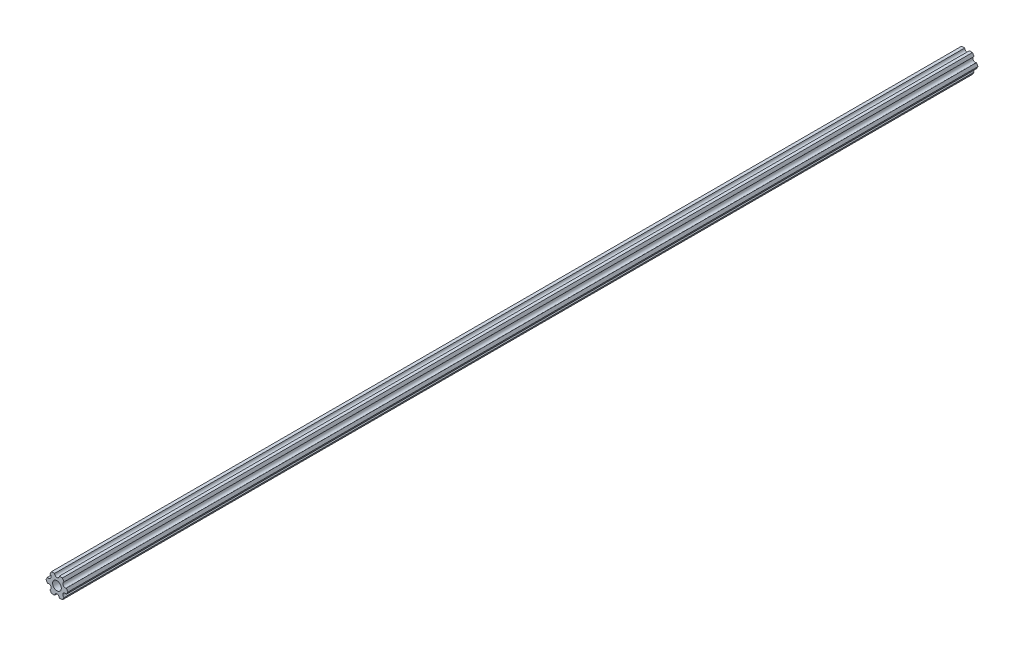
ISO-10303-21;
HEADER;
FILE_DESCRIPTION(('STEP AP214'),'2;1');
FILE_NAME('part.step','',(''),(''),'','','');
FILE_SCHEMA(('AUTOMOTIVE_DESIGN { 1 0 10303 214 1 1 1 1 }'));
ENDSEC;
DATA;
#1=APPLICATION_CONTEXT('core data for automotive mechanical design processes');
#2=APPLICATION_PROTOCOL_DEFINITION('international standard','automotive_design',2000,#1);
#3=PRODUCT_CONTEXT('',#1,'mechanical');
#4=PRODUCT('Part','Part','',(#3));
#5=PRODUCT_RELATED_PRODUCT_CATEGORY('part','',(#4));
#6=PRODUCT_DEFINITION_FORMATION('','',#4);
#7=PRODUCT_DEFINITION_CONTEXT('part definition',#1,'design');
#8=PRODUCT_DEFINITION('design','',#6,#7);
#9=PRODUCT_DEFINITION_SHAPE('','',#8);
#10=(LENGTH_UNIT() NAMED_UNIT(*) SI_UNIT(.MILLI.,.METRE.));
#11=(NAMED_UNIT(*) PLANE_ANGLE_UNIT() SI_UNIT($,.RADIAN.));
#12=(NAMED_UNIT(*) SI_UNIT($,.STERADIAN.) SOLID_ANGLE_UNIT());
#13=UNCERTAINTY_MEASURE_WITH_UNIT(LENGTH_MEASURE(1.E-05),#10,'distance_accuracy_value','');
#14=(GEOMETRIC_REPRESENTATION_CONTEXT(3) GLOBAL_UNCERTAINTY_ASSIGNED_CONTEXT((#13)) GLOBAL_UNIT_ASSIGNED_CONTEXT((#10,
#11,#12)) REPRESENTATION_CONTEXT('',''));
#15=CARTESIAN_POINT('',(0.,0.,0.));
#16=DIRECTION('',(0.,0.,1.));
#17=DIRECTION('',(1.,0.,0.));
#18=AXIS2_PLACEMENT_3D('',#15,#16,#17);
#19=CARTESIAN_POINT('',(6.29301142309098,-1.80018429024546,85.725));
#20=DIRECTION('',(-0.866025434075723,0.499999947533953,0.));
#21=DIRECTION('',(0.,0.,1.));
#22=AXIS2_PLACEMENT_3D('',#19,#20,#21);
#23=PLANE('',#22);
#24=DIRECTION('',(0.,0.,1.));
#25=VECTOR('',#24,1.);
#26=CARTESIAN_POINT('',(7.33234841870827,4.44212519169686E-07,85.725));
#27=LINE('',#26,#25);
#28=CARTESIAN_POINT('',(7.33234841870826,4.44212518961143E-07,-523.875));
#29=VERTEX_POINT('',#28);
#30=CARTESIAN_POINT('',(7.33234841870826,4.44212519315656E-07,85.725));
#31=VERTEX_POINT('',#30);
#32=EDGE_CURVE('E11',#29,#31,#27,.T.);
#33=ORIENTED_EDGE('',*,*,#32,.T.);
#34=DIRECTION('',(0.499999947533953,0.866025434075723,0.));
#35=VECTOR('',#34,1.);
#36=CARTESIAN_POINT('',(6.29301142309098,-1.80018429024546,85.725));
#37=LINE('',#36,#35);
#38=CARTESIAN_POINT('',(6.29301142309098,-1.80018429024546,85.725));
#39=VERTEX_POINT('',#38);
#40=EDGE_CURVE('E301',#39,#31,#37,.T.);
#41=ORIENTED_EDGE('',*,*,#40,.F.);
#42=DIRECTION('',(0.,0.,-1.));
#43=VECTOR('',#42,1.);
#44=CARTESIAN_POINT('',(6.29301142309098,-1.80018429024546,85.725));
#45=LINE('',#44,#43);
#46=CARTESIAN_POINT('',(6.29301142309098,-1.80018429024546,-523.875));
#47=VERTEX_POINT('',#46);
#48=EDGE_CURVE('E300',#39,#47,#45,.T.);
#49=ORIENTED_EDGE('',*,*,#48,.T.);
#50=DIRECTION('',(-0.499999947533953,-0.866025434075723,0.));
#51=VECTOR('',#50,1.);
#52=CARTESIAN_POINT('',(6.29301142309098,-1.80018429024546,-523.875));
#53=LINE('',#52,#51);
#54=EDGE_CURVE('E219',#29,#47,#53,.T.);
#55=ORIENTED_EDGE('',*,*,#54,.F.);
#56=EDGE_LOOP('',(#33,#41,#49,#55));
#57=FACE_BOUND('',#56,.T.);
#58=ADVANCED_FACE('F51',(#57),#23,.F.);
#59=CARTESIAN_POINT('',(7.33234841870827,4.44212519169686E-07,85.725));
#60=DIRECTION('',(-0.866025373493145,-0.500000052466057,0.));
#61=DIRECTION('',(-0.500000052466057,0.866025373493145,0.));
#62=AXIS2_PLACEMENT_3D('',#59,#60,#61);
#63=PLANE('',#62);
#64=DIRECTION('',(0.,0.,1.));
#65=VECTOR('',#64,1.);
#66=CARTESIAN_POINT('',(6.29301120497139,1.80018505273894,85.725));
#67=LINE('',#66,#65);
#68=CARTESIAN_POINT('',(6.29301120497139,1.80018505273894,-523.875));
#69=VERTEX_POINT('',#68);
#70=CARTESIAN_POINT('',(6.29301120497139,1.80018505273894,85.725));
#71=VERTEX_POINT('',#70);
#72=EDGE_CURVE('E59',#69,#71,#67,.T.);
#73=ORIENTED_EDGE('',*,*,#72,.T.);
#74=DIRECTION('',(-0.500000052466057,0.866025373493145,0.));
#75=VECTOR('',#74,1.);
#76=CARTESIAN_POINT('',(7.33234841870827,4.44212519198906E-07,85.725));
#77=LINE('',#76,#75);
#78=EDGE_CURVE('E305',#31,#71,#77,.T.);
#79=ORIENTED_EDGE('',*,*,#78,.F.);
#80=ORIENTED_EDGE('',*,*,#32,.F.);
#81=DIRECTION('',(0.500000052466055,-0.866025373493145,0.));
#82=VECTOR('',#81,1.);
#83=CARTESIAN_POINT('',(7.33234841870826,4.44212518961143E-07,-523.875));
#84=LINE('',#83,#82);
#85=EDGE_CURVE('E213',#69,#29,#84,.T.);
#86=ORIENTED_EDGE('',*,*,#85,.F.);
#87=EDGE_LOOP('',(#73,#79,#80,#86));
#88=FACE_BOUND('',#87,.T.);
#89=ADVANCED_FACE('F214',(#88),#63,.F.);
#90=CARTESIAN_POINT('',(4.70551103839172,4.54981561357972,85.725));
#91=DIRECTION('',(-0.866025373493151,-0.500000052466046,0.));
#92=DIRECTION('',(-0.500000052466046,0.866025373493151,0.));
#93=AXIS2_PLACEMENT_3D('',#90,#91,#92);
#94=PLANE('',#93);
#95=DIRECTION('',(0.,0.,1.));
#96=VECTOR('',#95,1.);
#97=CARTESIAN_POINT('',(3.66617382465481,6.35000022210627,85.725));
#98=LINE('',#97,#96);
#99=CARTESIAN_POINT('',(3.66617382465481,6.35000022210627,-523.875));
#100=VERTEX_POINT('',#99);
#101=CARTESIAN_POINT('',(3.66617382465481,6.35000022210627,85.725));
#102=VERTEX_POINT('',#101);
#103=EDGE_CURVE('E211',#100,#102,#98,.T.);
#104=ORIENTED_EDGE('',*,*,#103,.T.);
#105=DIRECTION('',(-0.500000052466046,0.866025373493151,0.));
#106=VECTOR('',#105,1.);
#107=CARTESIAN_POINT('',(4.70551103839172,4.54981561357972,85.725));
#108=LINE('',#107,#106);
#109=CARTESIAN_POINT('',(4.70551103839172,4.54981561357972,85.725));
#110=VERTEX_POINT('',#109);
#111=EDGE_CURVE('E336',#110,#102,#108,.T.);
#112=ORIENTED_EDGE('',*,*,#111,.F.);
#113=DIRECTION('',(0.,0.,1.));
#114=VECTOR('',#113,1.);
#115=CARTESIAN_POINT('',(4.70551103839172,4.54981561357972,85.725));
#116=LINE('',#115,#114);
#117=CARTESIAN_POINT('',(4.70551103839172,4.54981561357972,-523.875));
#118=VERTEX_POINT('',#117);
#119=EDGE_CURVE('E299',#118,#110,#116,.T.);
#120=ORIENTED_EDGE('',*,*,#119,.F.);
#121=DIRECTION('',(0.500000052466045,-0.866025373493151,0.));
#122=VECTOR('',#121,1.);
#123=CARTESIAN_POINT('',(4.70551103839172,4.54981561357972,-523.875));
#124=LINE('',#123,#122);
#125=EDGE_CURVE('E225',#100,#118,#124,.T.);
#126=ORIENTED_EDGE('',*,*,#125,.F.);
#127=EDGE_LOOP('',(#104,#112,#120,#126));
#128=FACE_BOUND('',#127,.T.);
#129=ADVANCED_FACE('F412',(#128),#94,.F.);
#130=CARTESIAN_POINT('',(3.66617382465481,6.35000022210627,85.725));
#131=DIRECTION('',(6.05825850611185E-08,-1.,0.));
#132=DIRECTION('',(0.,0.,-1.));
#133=AXIS2_PLACEMENT_3D('',#130,#131,#132);
#134=PLANE('',#133);
#135=DIRECTION('',(0.,0.,1.));
#136=VECTOR('',#135,1.);
#137=CARTESIAN_POINT('',(1.58749961530074,6.35000009617482,85.725));
#138=LINE('',#137,#136);
#139=CARTESIAN_POINT('',(1.58749961530073,6.35000015914054,-523.875));
#140=VERTEX_POINT('',#139);
#141=CARTESIAN_POINT('',(1.58749961530073,6.35000015914054,85.725));
#142=VERTEX_POINT('',#141);
#143=EDGE_CURVE('E333',#140,#142,#138,.T.);
#144=ORIENTED_EDGE('',*,*,#143,.T.);
#145=DIRECTION('',(-1.,0.,0.));
#146=VECTOR('',#145,1.);
#147=CARTESIAN_POINT('',(5.49926112168156,6.35000022210627,85.725));
#148=LINE('',#147,#146);
#149=EDGE_CURVE('E340',#102,#142,#148,.T.);
#150=ORIENTED_EDGE('',*,*,#149,.F.);
#151=ORIENTED_EDGE('',*,*,#103,.F.);
#152=DIRECTION('',(1.,3.02912931564594E-08,0.));
#153=VECTOR('',#152,1.);
#154=CARTESIAN_POINT('',(3.66617382465481,6.35000022210627,-523.875));
#155=LINE('',#154,#153);
#156=EDGE_CURVE('E287',#140,#100,#155,.T.);
#157=ORIENTED_EDGE('',*,*,#156,.F.);
#158=EDGE_LOOP('',(#144,#150,#151,#157));
#159=FACE_BOUND('',#158,.T.);
#160=ADVANCED_FACE('F415',(#159),#134,.F.);
#161=CARTESIAN_POINT('',(-3.84699260060323E-07,6.35,85.725));
#162=DIRECTION('',(0.,0.,-1.));
#163=DIRECTION('',(-1.,0.,0.));
#164=AXIS2_PLACEMENT_3D('',#161,#162,#163);
#165=CYLINDRICAL_SURFACE('',#164,1.5875);
#166=DIRECTION('',(0.,0.,1.));
#167=VECTOR('',#166,1.);
#168=CARTESIAN_POINT('',(-1.58750038469926,6.34999990382518,85.725));
#169=LINE('',#168,#167);
#170=CARTESIAN_POINT('',(-1.58750038469926,6.34999990382519,-523.875));
#171=VERTEX_POINT('',#170);
#172=CARTESIAN_POINT('',(-1.58750038469926,6.34999990382519,85.725));
#173=VERTEX_POINT('',#172);
#174=EDGE_CURVE('E330',#171,#173,#169,.T.);
#175=ORIENTED_EDGE('',*,*,#174,.T.);
#176=CARTESIAN_POINT('',(-3.84699260060323E-07,6.35,85.725));
#177=DIRECTION('',(0.,0.,-1.));
#178=DIRECTION('',(-1.,0.,0.));
#179=AXIS2_PLACEMENT_3D('',#176,#177,#178);
#180=CIRCLE('',#179,1.5875);
#181=EDGE_CURVE('E344',#142,#173,#180,.T.);
#182=ORIENTED_EDGE('',*,*,#181,.F.);
#183=ORIENTED_EDGE('',*,*,#143,.F.);
#184=CARTESIAN_POINT('',(-3.84699260060323E-07,6.35,-523.875));
#185=DIRECTION('',(0.,0.,1.));
#186=DIRECTION('',(-1.,0.,0.));
#187=AXIS2_PLACEMENT_3D('',#184,#185,#186);
#188=CIRCLE('',#187,1.5875);
#189=EDGE_CURVE('E283',#171,#140,#188,.T.);
#190=ORIENTED_EDGE('',*,*,#189,.F.);
#191=EDGE_LOOP('',(#175,#182,#183,#190));
#192=FACE_BOUND('',#191,.T.);
#193=ADVANCED_FACE('F464',(#192),#165,.F.);
#194=CARTESIAN_POINT('',(-1.58750038469926,6.34999990382518,85.725));
#195=DIRECTION('',(6.05825963273174E-08,-1.,0.));
#196=DIRECTION('',(0.,0.,-1.));
#197=AXIS2_PLACEMENT_3D('',#194,#195,#196);
#198=PLANE('',#197);
#199=DIRECTION('',(0.,0.,1.));
#200=VECTOR('',#199,1.);
#201=CARTESIAN_POINT('',(-3.66617459405349,6.3499997778937,85.725));
#202=LINE('',#201,#200);
#203=CARTESIAN_POINT('',(-3.66617454558244,6.34999986184803,-523.875));
#204=VERTEX_POINT('',#203);
#205=CARTESIAN_POINT('',(-3.66617454558244,6.34999986184803,85.725));
#206=VERTEX_POINT('',#205);
#207=EDGE_CURVE('E323',#204,#206,#202,.T.);
#208=ORIENTED_EDGE('',*,*,#207,.T.);
#209=DIRECTION('',(-1.,0.,0.));
#210=VECTOR('',#209,1.);
#211=CARTESIAN_POINT('',(5.49926112168156,6.34999990382519,85.725));
#212=LINE('',#211,#210);
#213=EDGE_CURVE('E348',#173,#206,#212,.T.);
#214=ORIENTED_EDGE('',*,*,#213,.F.);
#215=ORIENTED_EDGE('',*,*,#174,.F.);
#216=DIRECTION('',(1.,2.0194198968488E-08,0.));
#217=VECTOR('',#216,1.);
#218=CARTESIAN_POINT('',(-1.58750038469926,6.34999990382519,-523.875));
#219=LINE('',#218,#217);
#220=EDGE_CURVE('E279',#204,#171,#219,.T.);
#221=ORIENTED_EDGE('',*,*,#220,.F.);
#222=EDGE_LOOP('',(#208,#214,#215,#221));
#223=FACE_BOUND('',#222,.T.);
#224=ADVANCED_FACE('F461',(#223),#198,.F.);
#225=CARTESIAN_POINT('',(-3.66617459405349,6.3499997778937,85.725));
#226=DIRECTION('',(0.866025434075729,-0.499999947533942,0.));
#227=DIRECTION('',(0.,0.,-1.));
#228=AXIS2_PLACEMENT_3D('',#225,#226,#227);
#229=PLANE('',#228);
#230=DIRECTION('',(0.,0.,1.));
#231=VECTOR('',#230,1.);
#232=CARTESIAN_POINT('',(-4.70551158967065,4.54981504343587,85.725));
#233=LINE('',#232,#231);
#234=CARTESIAN_POINT('',(-4.70551158967065,4.54981504343587,-523.875));
#235=VERTEX_POINT('',#234);
#236=CARTESIAN_POINT('',(-4.70551158967065,4.54981504343587,85.725));
#237=VERTEX_POINT('',#236);
#238=EDGE_CURVE('E320',#235,#237,#233,.T.);
#239=ORIENTED_EDGE('',*,*,#238,.T.);
#240=DIRECTION('',(-0.499999947533943,-0.866025434075729,0.));
#241=VECTOR('',#240,1.);
#242=CARTESIAN_POINT('',(-3.66617459405349,6.3499997778937,85.725));
#243=LINE('',#242,#241);
#244=EDGE_CURVE('E352',#206,#237,#243,.T.);
#245=ORIENTED_EDGE('',*,*,#244,.F.);
#246=ORIENTED_EDGE('',*,*,#207,.F.);
#247=DIRECTION('',(0.499999947533939,0.866025434075731,0.));
#248=VECTOR('',#247,1.);
#249=CARTESIAN_POINT('',(-3.66617454558244,6.34999986184803,-523.875));
#250=LINE('',#249,#248);
#251=EDGE_CURVE('E275',#235,#204,#250,.T.);
#252=ORIENTED_EDGE('',*,*,#251,.F.);
#253=EDGE_LOOP('',(#239,#245,#246,#252));
#254=FACE_BOUND('',#253,.T.);
#255=ADVANCED_FACE('F457',(#254),#229,.F.);
#256=CARTESIAN_POINT('',(-5.49926150638082,3.17499966684067,85.725));
#257=DIRECTION('',(0.,0.,-1.));
#258=DIRECTION('',(-1.,0.,0.));
#259=AXIS2_PLACEMENT_3D('',#256,#257,#258);
#260=CYLINDRICAL_SURFACE('',#259,1.5875);
#261=DIRECTION('',(0.,0.,1.));
#262=VECTOR('',#261,1.);
#263=CARTESIAN_POINT('',(-6.29301142309098,1.80018429024547,85.725));
#264=LINE('',#263,#262);
#265=CARTESIAN_POINT('',(-6.29301142309098,1.80018429024546,-523.875));
#266=VERTEX_POINT('',#265);
#267=CARTESIAN_POINT('',(-6.29301142309098,1.80018429024547,85.725));
#268=VERTEX_POINT('',#267);
#269=EDGE_CURVE('E324',#266,#268,#264,.T.);
#270=ORIENTED_EDGE('',*,*,#269,.T.);
#271=CARTESIAN_POINT('',(-5.49926150638082,3.17499966684067,85.725));
#272=DIRECTION('',(0.,0.,-1.));
#273=DIRECTION('',(-1.,0.,0.));
#274=AXIS2_PLACEMENT_3D('',#271,#272,#273);
#275=CIRCLE('',#274,1.5875);
#276=EDGE_CURVE('E362',#237,#268,#275,.T.);
#277=ORIENTED_EDGE('',*,*,#276,.F.);
#278=ORIENTED_EDGE('',*,*,#238,.F.);
#279=CARTESIAN_POINT('',(-5.49926150638082,3.17499966684067,-523.875));
#280=DIRECTION('',(0.,0.,1.));
#281=DIRECTION('',(-1.,0.,0.));
#282=AXIS2_PLACEMENT_3D('',#279,#280,#281);
#283=CIRCLE('',#282,1.5875);
#284=EDGE_CURVE('E271',#266,#235,#283,.T.);
#285=ORIENTED_EDGE('',*,*,#284,.F.);
#286=EDGE_LOOP('',(#270,#277,#278,#285));
#287=FACE_BOUND('',#286,.T.);
#288=ADVANCED_FACE('F453',(#287),#260,.F.);
#289=CARTESIAN_POINT('',(-6.29301142309098,1.80018429024547,85.725));
#290=DIRECTION('',(0.866025434075724,-0.499999947533952,0.));
#291=DIRECTION('',(0.,0.,-1.));
#292=AXIS2_PLACEMENT_3D('',#289,#290,#291);
#293=PLANE('',#292);
#294=DIRECTION('',(0.,0.,1.));
#295=VECTOR('',#294,1.);
#296=CARTESIAN_POINT('',(-7.33234841870827,-4.44212523790841E-07,85.725));
#297=LINE('',#296,#295);
#298=CARTESIAN_POINT('',(-7.33234841870826,-4.44212524036367E-07,-523.875));
#299=VERTEX_POINT('',#298);
#300=CARTESIAN_POINT('',(-7.33234841870826,-4.44212524036367E-07,85.725));
#301=VERTEX_POINT('',#300);
#302=EDGE_CURVE('E317',#299,#301,#297,.T.);
#303=ORIENTED_EDGE('',*,*,#302,.T.);
#304=DIRECTION('',(-0.499999947533952,-0.866025434075724,0.));
#305=VECTOR('',#304,1.);
#306=CARTESIAN_POINT('',(-6.29301142309098,1.80018429024547,85.725));
#307=LINE('',#306,#305);
#308=EDGE_CURVE('E358',#268,#301,#307,.T.);
#309=ORIENTED_EDGE('',*,*,#308,.F.);
#310=ORIENTED_EDGE('',*,*,#269,.F.);
#311=DIRECTION('',(0.499999947533951,0.866025434075724,0.));
#312=VECTOR('',#311,1.);
#313=CARTESIAN_POINT('',(-6.29301142309098,1.80018429024547,-523.875));
#314=LINE('',#313,#312);
#315=EDGE_CURVE('E267',#299,#266,#314,.T.);
#316=ORIENTED_EDGE('',*,*,#315,.F.);
#317=EDGE_LOOP('',(#303,#309,#310,#316));
#318=FACE_BOUND('',#317,.T.);
#319=ADVANCED_FACE('F449',(#318),#293,.F.);
#320=CARTESIAN_POINT('',(-7.33234841870827,-4.44212523790841E-07,85.725));
#321=DIRECTION('',(0.866025373493151,0.500000052466045,0.));
#322=DIRECTION('',(0.,0.,-1.));
#323=AXIS2_PLACEMENT_3D('',#320,#321,#322);
#324=PLANE('',#323);
#325=DIRECTION('',(0.,0.,1.));
#326=VECTOR('',#325,1.);
#327=CARTESIAN_POINT('',(-6.29301120497141,-1.80018505273897,85.725));
#328=LINE('',#327,#326);
#329=CARTESIAN_POINT('',(-6.29301120497141,-1.80018505273897,-523.875));
#330=VERTEX_POINT('',#329);
#331=CARTESIAN_POINT('',(-6.29301120497141,-1.80018505273897,85.725));
#332=VERTEX_POINT('',#331);
#333=EDGE_CURVE('E310',#330,#332,#328,.T.);
#334=ORIENTED_EDGE('',*,*,#333,.T.);
#335=DIRECTION('',(0.500000052466045,-0.866025373493151,0.));
#336=VECTOR('',#335,1.);
#337=CARTESIAN_POINT('',(-7.33234841870827,-4.44212523969395E-07,85.725));
#338=LINE('',#337,#336);
#339=EDGE_CURVE('E353',#301,#332,#338,.T.);
#340=ORIENTED_EDGE('',*,*,#339,.F.);
#341=ORIENTED_EDGE('',*,*,#302,.F.);
#342=DIRECTION('',(-0.500000052466045,0.866025373493152,0.));
#343=VECTOR('',#342,1.);
#344=CARTESIAN_POINT('',(-7.33234841870826,-4.44212524036367E-07,-523.875));
#345=LINE('',#344,#343);
#346=EDGE_CURVE('E263',#330,#299,#345,.T.);
#347=ORIENTED_EDGE('',*,*,#346,.F.);
#348=EDGE_LOOP('',(#334,#340,#341,#347));
#349=FACE_BOUND('',#348,.T.);
#350=ADVANCED_FACE('F445',(#349),#324,.F.);
#351=CARTESIAN_POINT('',(-5.49926112168156,-3.17500033315934,85.725));
#352=DIRECTION('',(0.,0.,-1.));
#353=DIRECTION('',(-1.,0.,0.));
#354=AXIS2_PLACEMENT_3D('',#351,#352,#353);
#355=CYLINDRICAL_SURFACE('',#354,1.5875);
#356=DIRECTION('',(0.,0.,1.));
#357=VECTOR('',#356,1.);
#358=CARTESIAN_POINT('',(-4.70551103839172,-4.54981561357972,85.725));
#359=LINE('',#358,#357);
#360=CARTESIAN_POINT('',(-4.70551103839172,-4.54981561357972,-523.875));
#361=VERTEX_POINT('',#360);
#362=CARTESIAN_POINT('',(-4.70551103839172,-4.54981561357972,85.725));
#363=VERTEX_POINT('',#362);
#364=EDGE_CURVE('E307',#361,#363,#359,.T.);
#365=ORIENTED_EDGE('',*,*,#364,.T.);
#366=CARTESIAN_POINT('',(-5.49926112168156,-3.17500033315934,85.725));
#367=DIRECTION('',(0.,0.,-1.));
#368=DIRECTION('',(-1.,0.,0.));
#369=AXIS2_PLACEMENT_3D('',#366,#367,#368);
#370=CIRCLE('',#369,1.5875);
#371=EDGE_CURVE('E357',#332,#363,#370,.T.);
#372=ORIENTED_EDGE('',*,*,#371,.F.);
#373=ORIENTED_EDGE('',*,*,#333,.F.);
#374=CARTESIAN_POINT('',(-5.49926112168156,-3.17500033315934,-523.875));
#375=DIRECTION('',(0.,0.,1.));
#376=DIRECTION('',(-1.,0.,0.));
#377=AXIS2_PLACEMENT_3D('',#374,#375,#376);
#378=CIRCLE('',#377,1.5875);
#379=EDGE_CURVE('E259',#361,#330,#378,.T.);
#380=ORIENTED_EDGE('',*,*,#379,.F.);
#381=EDGE_LOOP('',(#365,#372,#373,#380));
#382=FACE_BOUND('',#381,.T.);
#383=ADVANCED_FACE('F441',(#382),#355,.F.);
#384=CARTESIAN_POINT('',(-4.70551103839172,-4.54981561357972,85.725));
#385=DIRECTION('',(0.866025373493152,0.500000052466045,0.));
#386=DIRECTION('',(0.,0.,-1.));
#387=AXIS2_PLACEMENT_3D('',#384,#385,#386);
#388=PLANE('',#387);
#389=DIRECTION('',(0.,0.,1.));
#390=VECTOR('',#389,1.);
#391=CARTESIAN_POINT('',(-3.66617382465481,-6.35000022210628,85.725));
#392=LINE('',#391,#390);
#393=CARTESIAN_POINT('',(-3.66617382465481,-6.35000022210628,-523.875));
#394=VERTEX_POINT('',#393);
#395=CARTESIAN_POINT('',(-3.66617382465481,-6.35000022210628,85.725));
#396=VERTEX_POINT('',#395);
#397=EDGE_CURVE('E311',#394,#396,#392,.T.);
#398=ORIENTED_EDGE('',*,*,#397,.T.);
#399=DIRECTION('',(0.500000052466045,-0.866025373493151,0.));
#400=VECTOR('',#399,1.);
#401=CARTESIAN_POINT('',(-4.70551103839172,-4.54981561357972,85.725));
#402=LINE('',#401,#400);
#403=EDGE_CURVE('E372',#363,#396,#402,.T.);
#404=ORIENTED_EDGE('',*,*,#403,.F.);
#405=ORIENTED_EDGE('',*,*,#364,.F.);
#406=DIRECTION('',(-0.500000052466043,0.866025373493152,0.));
#407=VECTOR('',#406,1.);
#408=CARTESIAN_POINT('',(-4.70551103839172,-4.54981561357972,-523.875));
#409=LINE('',#408,#407);
#410=EDGE_CURVE('E255',#394,#361,#409,.T.);
#411=ORIENTED_EDGE('',*,*,#410,.F.);
#412=EDGE_LOOP('',(#398,#404,#405,#411));
#413=FACE_BOUND('',#412,.T.);
#414=ADVANCED_FACE('F437',(#413),#388,.F.);
#415=CARTESIAN_POINT('',(-3.66617382465481,-6.35000022210628,85.725));
#416=DIRECTION('',(-6.05825854783851E-08,1.,0.));
#417=DIRECTION('',(0.,0.,1.));
#418=AXIS2_PLACEMENT_3D('',#415,#416,#417);
#419=PLANE('',#418);
#420=DIRECTION('',(0.,0.,1.));
#421=VECTOR('',#420,1.);
#422=CARTESIAN_POINT('',(-1.58749961530074,-6.35,85.725));
#423=LINE('',#422,#421);
#424=CARTESIAN_POINT('',(-1.58749961530073,-6.35000011105314,-523.875));
#425=VERTEX_POINT('',#424);
#426=CARTESIAN_POINT('',(-1.58749961530073,-6.35000011105314,85.725));
#427=VERTEX_POINT('',#426);
#428=EDGE_CURVE('E82',#425,#427,#423,.T.);
#429=ORIENTED_EDGE('',*,*,#428,.T.);
#430=DIRECTION('',(1.,0.,0.));
#431=VECTOR('',#430,1.);
#432=CARTESIAN_POINT('',(5.49926112168156,-6.35000022210628,85.725));
#433=LINE('',#432,#431);
#434=EDGE_CURVE('E376',#396,#427,#433,.T.);
#435=ORIENTED_EDGE('',*,*,#434,.F.);
#436=ORIENTED_EDGE('',*,*,#397,.F.);
#437=DIRECTION('',(-0.999999999999999,-5.34249856349036E-08,0.));
#438=VECTOR('',#437,1.);
#439=CARTESIAN_POINT('',(-3.66617382465481,-6.35000022210628,-523.875));
#440=LINE('',#439,#438);
#441=EDGE_CURVE('E251',#425,#394,#440,.T.);
#442=ORIENTED_EDGE('',*,*,#441,.F.);
#443=EDGE_LOOP('',(#429,#435,#436,#442));
#444=FACE_BOUND('',#443,.T.);
#445=ADVANCED_FACE('F434',(#444),#419,.F.);
#446=CARTESIAN_POINT('',(3.8469926204343E-07,-6.35,85.725));
#447=DIRECTION('',(0.,0.,-1.));
#448=DIRECTION('',(-1.,0.,0.));
#449=AXIS2_PLACEMENT_3D('',#446,#447,#448);
#450=CYLINDRICAL_SURFACE('',#449,1.5875);
#451=DIRECTION('',(0.,0.,1.));
#452=VECTOR('',#451,1.);
#453=CARTESIAN_POINT('',(1.58750038469926,-6.34999990382518,85.725));
#454=LINE('',#453,#452);
#455=CARTESIAN_POINT('',(1.58750038469926,-6.34999990382519,-523.875));
#456=VERTEX_POINT('',#455);
#457=CARTESIAN_POINT('',(1.58750038469926,-6.34999990382519,85.725));
#458=VERTEX_POINT('',#457);
#459=EDGE_CURVE('E71',#456,#458,#454,.T.);
#460=ORIENTED_EDGE('',*,*,#459,.T.);
#461=CARTESIAN_POINT('',(3.8469926204343E-07,-6.35,85.725));
#462=DIRECTION('',(0.,0.,-1.));
#463=DIRECTION('',(-1.,0.,0.));
#464=AXIS2_PLACEMENT_3D('',#461,#462,#463);
#465=CIRCLE('',#464,1.5875);
#466=EDGE_CURVE('E380',#427,#458,#465,.T.);
#467=ORIENTED_EDGE('',*,*,#466,.F.);
#468=ORIENTED_EDGE('',*,*,#428,.F.);
#469=CARTESIAN_POINT('',(3.8469926204343E-07,-6.35,-523.875));
#470=DIRECTION('',(0.,0.,1.));
#471=DIRECTION('',(-1.,0.,0.));
#472=AXIS2_PLACEMENT_3D('',#469,#470,#471);
#473=CIRCLE('',#472,1.5875);
#474=EDGE_CURVE('E247',#456,#425,#473,.T.);
#475=ORIENTED_EDGE('',*,*,#474,.F.);
#476=EDGE_LOOP('',(#460,#467,#468,#475));
#477=FACE_BOUND('',#476,.T.);
#478=ADVANCED_FACE('F432',(#477),#450,.F.);
#479=CARTESIAN_POINT('',(1.58750038469926,-6.34999990382518,85.725));
#480=DIRECTION('',(-6.05825721258438E-08,1.,0.));
#481=DIRECTION('',(0.,0.,1.));
#482=AXIS2_PLACEMENT_3D('',#479,#480,#481);
#483=PLANE('',#482);
#484=DIRECTION('',(0.,0.,1.));
#485=VECTOR('',#484,1.);
#486=CARTESIAN_POINT('',(3.66617459405346,-6.34999977789375,85.725));
#487=LINE('',#486,#485);
#488=CARTESIAN_POINT('',(3.66617454558244,-6.34999986184804,-523.875));
#489=VERTEX_POINT('',#488);
#490=CARTESIAN_POINT('',(3.66617454558244,-6.34999986184804,85.725));
#491=VERTEX_POINT('',#490);
#492=EDGE_CURVE('E381',#489,#491,#487,.T.);
#493=ORIENTED_EDGE('',*,*,#492,.T.);
#494=DIRECTION('',(1.,0.,0.));
#495=VECTOR('',#494,1.);
#496=CARTESIAN_POINT('',(5.49926112168156,-6.34999990382519,85.725));
#497=LINE('',#496,#495);
#498=EDGE_CURVE('E388',#458,#491,#497,.T.);
#499=ORIENTED_EDGE('',*,*,#498,.F.);
#500=ORIENTED_EDGE('',*,*,#459,.F.);
#501=DIRECTION('',(-1.,-2.01941943785532E-08,0.));
#502=VECTOR('',#501,1.);
#503=CARTESIAN_POINT('',(1.58750038469926,-6.34999990382519,-523.875));
#504=LINE('',#503,#502);
#505=EDGE_CURVE('E243',#489,#456,#504,.T.);
#506=ORIENTED_EDGE('',*,*,#505,.F.);
#507=EDGE_LOOP('',(#493,#499,#500,#506));
#508=FACE_BOUND('',#507,.T.);
#509=ADVANCED_FACE('F431',(#508),#483,.F.);
#510=CARTESIAN_POINT('',(3.66617459405346,-6.34999977789375,85.725));
#511=DIRECTION('',(-0.86602543407573,0.499999947533941,0.));
#512=DIRECTION('',(0.,0.,1.));
#513=AXIS2_PLACEMENT_3D('',#510,#511,#512);
#514=PLANE('',#513);
#515=DIRECTION('',(0.,0.,-1.));
#516=VECTOR('',#515,1.);
#517=CARTESIAN_POINT('',(4.70551158967065,-4.54981504343587,85.725));
#518=LINE('',#517,#516);
#519=CARTESIAN_POINT('',(4.70551158967065,-4.54981504343587,85.725));
#520=VERTEX_POINT('',#519);
#521=CARTESIAN_POINT('',(4.70551158967065,-4.54981504343587,-523.875));
#522=VERTEX_POINT('',#521);
#523=EDGE_CURVE('E384',#520,#522,#518,.T.);
#524=ORIENTED_EDGE('',*,*,#523,.F.);
#525=DIRECTION('',(0.49999994753394,0.86602543407573,0.));
#526=VECTOR('',#525,1.);
#527=CARTESIAN_POINT('',(3.66617459405346,-6.34999977789376,85.725));
#528=LINE('',#527,#526);
#529=EDGE_CURVE('E306',#491,#520,#528,.T.);
#530=ORIENTED_EDGE('',*,*,#529,.F.);
#531=ORIENTED_EDGE('',*,*,#492,.F.);
#532=DIRECTION('',(-0.499999947533941,-0.86602543407573,0.));
#533=VECTOR('',#532,1.);
#534=CARTESIAN_POINT('',(3.66617454558244,-6.34999986184804,-523.875));
#535=LINE('',#534,#533);
#536=EDGE_CURVE('E239',#522,#489,#535,.T.);
#537=ORIENTED_EDGE('',*,*,#536,.F.);
#538=EDGE_LOOP('',(#524,#530,#531,#537));
#539=FACE_BOUND('',#538,.T.);
#540=ADVANCED_FACE('F428',(#539),#514,.F.);
#541=CARTESIAN_POINT('',(5.49926112168156,3.17500033315934,85.725));
#542=DIRECTION('',(0.,0.,1.));
#543=DIRECTION('',(1.,0.,0.));
#544=AXIS2_PLACEMENT_3D('',#541,#542,#543);
#545=PLANE('',#544);
#546=CARTESIAN_POINT('',(0.,0.,85.725));
#547=DIRECTION('',(0.,0.,-1.));
#548=DIRECTION('',(-1.,0.,0.));
#549=AXIS2_PLACEMENT_3D('',#546,#547,#548);
#550=CIRCLE('',#549,2.9337);
#551=CARTESIAN_POINT('',(-2.9337,0.,85.725));
#552=VERTEX_POINT('',#551);
#553=EDGE_CURVE('E292',#552,#552,#550,.T.);
#554=ORIENTED_EDGE('',*,*,#553,.T.);
#555=EDGE_LOOP('',(#554));
#556=FACE_BOUND('',#555,.T.);
#557=ORIENTED_EDGE('',*,*,#529,.T.);
#558=CARTESIAN_POINT('',(5.49926150638082,-3.17499966684067,85.725));
#559=DIRECTION('',(0.,0.,-1.));
#560=DIRECTION('',(-1.,0.,0.));
#561=AXIS2_PLACEMENT_3D('',#558,#559,#560);
#562=CIRCLE('',#561,1.5875);
#563=EDGE_CURVE('E296',#520,#39,#562,.T.);
#564=ORIENTED_EDGE('',*,*,#563,.T.);
#565=ORIENTED_EDGE('',*,*,#40,.T.);
#566=ORIENTED_EDGE('',*,*,#78,.T.);
#567=CARTESIAN_POINT('',(5.49926112168156,3.17500033315934,85.725));
#568=DIRECTION('',(0.,0.,-1.));
#569=DIRECTION('',(-1.,0.,0.));
#570=AXIS2_PLACEMENT_3D('',#567,#568,#569);
#571=CIRCLE('',#570,1.5875);
#572=EDGE_CURVE('E206',#71,#110,#571,.T.);
#573=ORIENTED_EDGE('',*,*,#572,.T.);
#574=ORIENTED_EDGE('',*,*,#111,.T.);
#575=ORIENTED_EDGE('',*,*,#149,.T.);
#576=ORIENTED_EDGE('',*,*,#181,.T.);
#577=ORIENTED_EDGE('',*,*,#213,.T.);
#578=ORIENTED_EDGE('',*,*,#244,.T.);
#579=ORIENTED_EDGE('',*,*,#276,.T.);
#580=ORIENTED_EDGE('',*,*,#308,.T.);
#581=ORIENTED_EDGE('',*,*,#339,.T.);
#582=ORIENTED_EDGE('',*,*,#371,.T.);
#583=ORIENTED_EDGE('',*,*,#403,.T.);
#584=ORIENTED_EDGE('',*,*,#434,.T.);
#585=ORIENTED_EDGE('',*,*,#466,.T.);
#586=ORIENTED_EDGE('',*,*,#498,.T.);
#587=EDGE_LOOP('',(#557,#564,#565,#566,#573,#574,#575,#576,#577,#578,#579,#580,#581,#582,#583,
#584,#585,#586));
#588=FACE_BOUND('',#587,.T.);
#589=ADVANCED_FACE('F418',(#556,#588),#545,.T.);
#590=CARTESIAN_POINT('',(5.49926112168156,3.17500033315934,85.725));
#591=DIRECTION('',(0.,0.,-1.));
#592=DIRECTION('',(-1.,0.,0.));
#593=AXIS2_PLACEMENT_3D('',#590,#591,#592);
#594=CYLINDRICAL_SURFACE('',#593,1.5875);
#595=ORIENTED_EDGE('',*,*,#572,.F.);
#596=ORIENTED_EDGE('',*,*,#72,.F.);
#597=CARTESIAN_POINT('',(5.49926112168156,3.17500033315934,-523.875));
#598=DIRECTION('',(0.,0.,1.));
#599=DIRECTION('',(-1.,0.,0.));
#600=AXIS2_PLACEMENT_3D('',#597,#598,#599);
#601=CIRCLE('',#600,1.5875);
#602=EDGE_CURVE('E203',#118,#69,#601,.T.);
#603=ORIENTED_EDGE('',*,*,#602,.F.);
#604=ORIENTED_EDGE('',*,*,#119,.T.);
#605=EDGE_LOOP('',(#595,#596,#603,#604));
#606=FACE_BOUND('',#605,.T.);
#607=ADVANCED_FACE('F200',(#606),#594,.F.);
#608=CARTESIAN_POINT('',(5.49926150638082,-3.17499966684067,85.725));
#609=DIRECTION('',(0.,0.,-1.));
#610=DIRECTION('',(-1.,0.,0.));
#611=AXIS2_PLACEMENT_3D('',#608,#609,#610);
#612=CYLINDRICAL_SURFACE('',#611,1.5875);
#613=ORIENTED_EDGE('',*,*,#563,.F.);
#614=ORIENTED_EDGE('',*,*,#523,.T.);
#615=CARTESIAN_POINT('',(5.49926150638082,-3.17499966684067,-523.875));
#616=DIRECTION('',(0.,0.,1.));
#617=DIRECTION('',(-1.,0.,0.));
#618=AXIS2_PLACEMENT_3D('',#615,#616,#617);
#619=CIRCLE('',#618,1.5875);
#620=EDGE_CURVE('E235',#47,#522,#619,.T.);
#621=ORIENTED_EDGE('',*,*,#620,.F.);
#622=ORIENTED_EDGE('',*,*,#48,.F.);
#623=EDGE_LOOP('',(#613,#614,#621,#622));
#624=FACE_BOUND('',#623,.T.);
#625=ADVANCED_FACE('F423',(#624),#612,.F.);
#626=CARTESIAN_POINT('',(0.,0.,85.725));
#627=DIRECTION('',(0.,0.,-1.));
#628=DIRECTION('',(-1.,0.,0.));
#629=AXIS2_PLACEMENT_3D('',#626,#627,#628);
#630=CYLINDRICAL_SURFACE('',#629,2.9337);
#631=ORIENTED_EDGE('',*,*,#553,.F.);
#632=EDGE_LOOP('',(#631));
#633=FACE_BOUND('',#632,.T.);
#634=CARTESIAN_POINT('',(0.,0.,-523.875));
#635=DIRECTION('',(0.,0.,-1.));
#636=DIRECTION('',(-1.,0.,0.));
#637=AXIS2_PLACEMENT_3D('',#634,#635,#636);
#638=CIRCLE('',#637,2.9337);
#639=CARTESIAN_POINT('',(-2.9337,0.,-523.875));
#640=VERTEX_POINT('',#639);
#641=EDGE_CURVE('E227',#640,#640,#638,.T.);
#642=ORIENTED_EDGE('',*,*,#641,.T.);
#643=EDGE_LOOP('',(#642));
#644=FACE_BOUND('',#643,.T.);
#645=ADVANCED_FACE('F483',(#633,#644),#630,.F.);
#646=CARTESIAN_POINT('',(5.49926112168156,3.17500033315934,-523.875));
#647=DIRECTION('',(0.,0.,-1.));
#648=DIRECTION('',(-1.,0.,0.));
#649=AXIS2_PLACEMENT_3D('',#646,#647,#648);
#650=PLANE('',#649);
#651=ORIENTED_EDGE('',*,*,#602,.T.);
#652=ORIENTED_EDGE('',*,*,#85,.T.);
#653=ORIENTED_EDGE('',*,*,#54,.T.);
#654=ORIENTED_EDGE('',*,*,#620,.T.);
#655=ORIENTED_EDGE('',*,*,#536,.T.);
#656=ORIENTED_EDGE('',*,*,#505,.T.);
#657=ORIENTED_EDGE('',*,*,#474,.T.);
#658=ORIENTED_EDGE('',*,*,#441,.T.);
#659=ORIENTED_EDGE('',*,*,#410,.T.);
#660=ORIENTED_EDGE('',*,*,#379,.T.);
#661=ORIENTED_EDGE('',*,*,#346,.T.);
#662=ORIENTED_EDGE('',*,*,#315,.T.);
#663=ORIENTED_EDGE('',*,*,#284,.T.);
#664=ORIENTED_EDGE('',*,*,#251,.T.);
#665=ORIENTED_EDGE('',*,*,#220,.T.);
#666=ORIENTED_EDGE('',*,*,#189,.T.);
#667=ORIENTED_EDGE('',*,*,#156,.T.);
#668=ORIENTED_EDGE('',*,*,#125,.T.);
#669=EDGE_LOOP('',(#651,#652,#653,#654,#655,#656,#657,#658,#659,#660,#661,#662,#663,#664,#665,
#666,#667,#668));
#670=FACE_BOUND('',#669,.T.);
#671=ORIENTED_EDGE('',*,*,#641,.F.);
#672=EDGE_LOOP('',(#671));
#673=FACE_BOUND('',#672,.T.);
#674=ADVANCED_FACE('F221',(#670,#673),#650,.T.);
#675=CLOSED_SHELL('',(#58,#89,#129,#160,#193,#224,#255,#288,#319,#350,#383,#414,#445,#478,#509,
#540,#589,#607,#625,#645,#674));
#676=MANIFOLD_SOLID_BREP('B2',#675);
#677=ADVANCED_BREP_SHAPE_REPRESENTATION('',(#18,#676),#14);
#678=SHAPE_DEFINITION_REPRESENTATION(#9,#677);
ENDSEC;
END-ISO-10303-21;
